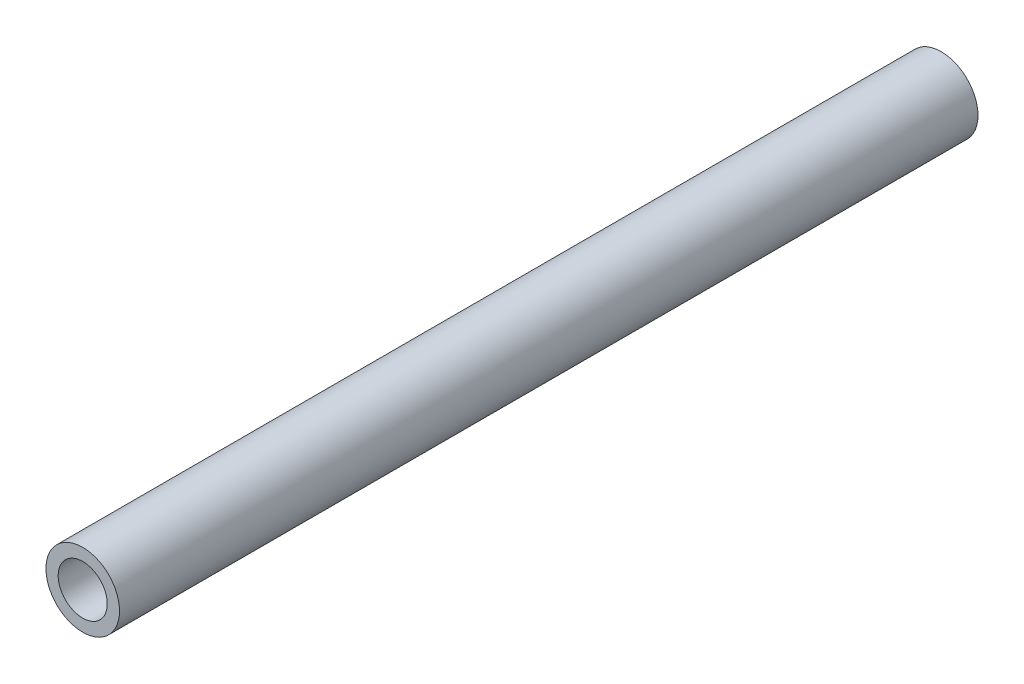
ISO-10303-21;
HEADER;
FILE_DESCRIPTION(('STEP AP214'),'2;1');
FILE_NAME('part.step','',(''),(''),'','','');
FILE_SCHEMA(('AUTOMOTIVE_DESIGN { 1 0 10303 214 1 1 1 1 }'));
ENDSEC;
DATA;
#1=APPLICATION_CONTEXT('core data for automotive mechanical design processes');
#2=APPLICATION_PROTOCOL_DEFINITION('international standard','automotive_design',2000,#1);
#3=PRODUCT_CONTEXT('',#1,'mechanical');
#4=PRODUCT('Part','Part','',(#3));
#5=PRODUCT_RELATED_PRODUCT_CATEGORY('part','',(#4));
#6=PRODUCT_DEFINITION_FORMATION('','',#4);
#7=PRODUCT_DEFINITION_CONTEXT('part definition',#1,'design');
#8=PRODUCT_DEFINITION('design','',#6,#7);
#9=PRODUCT_DEFINITION_SHAPE('','',#8);
#10=(LENGTH_UNIT() NAMED_UNIT(*) SI_UNIT(.MILLI.,.METRE.));
#11=(NAMED_UNIT(*) PLANE_ANGLE_UNIT() SI_UNIT($,.RADIAN.));
#12=(NAMED_UNIT(*) SI_UNIT($,.STERADIAN.) SOLID_ANGLE_UNIT());
#13=UNCERTAINTY_MEASURE_WITH_UNIT(LENGTH_MEASURE(1.E-05),#10,'distance_accuracy_value','');
#14=(GEOMETRIC_REPRESENTATION_CONTEXT(3) GLOBAL_UNCERTAINTY_ASSIGNED_CONTEXT((#13)) GLOBAL_UNIT_ASSIGNED_CONTEXT((#10,
#11,#12)) REPRESENTATION_CONTEXT('',''));
#15=CARTESIAN_POINT('',(0.,0.,0.));
#16=DIRECTION('',(0.,0.,1.));
#17=DIRECTION('',(1.,0.,0.));
#18=AXIS2_PLACEMENT_3D('',#15,#16,#17);
#19=CARTESIAN_POINT('',(0.,0.,70.));
#20=DIRECTION('',(0.,0.,1.));
#21=DIRECTION('',(1.,0.,0.));
#22=AXIS2_PLACEMENT_3D('',#19,#20,#21);
#23=PLANE('',#22);
#24=CARTESIAN_POINT('',(0.,0.,70.));
#25=DIRECTION('',(0.,0.,1.));
#26=DIRECTION('',(1.,0.,0.));
#27=AXIS2_PLACEMENT_3D('',#24,#25,#26);
#28=CIRCLE('',#27,3.);
#29=CARTESIAN_POINT('',(3.,0.,70.));
#30=VERTEX_POINT('',#29);
#31=EDGE_CURVE('E10',#30,#30,#28,.T.);
#32=ORIENTED_EDGE('',*,*,#31,.T.);
#33=EDGE_LOOP('',(#32));
#34=FACE_BOUND('',#33,.T.);
#35=CARTESIAN_POINT('',(0.,0.,70.));
#36=DIRECTION('',(0.,0.,1.));
#37=DIRECTION('',(1.,0.,0.));
#38=AXIS2_PLACEMENT_3D('',#35,#36,#37);
#39=CIRCLE('',#38,2.);
#40=CARTESIAN_POINT('',(2.,0.,70.));
#41=VERTEX_POINT('',#40);
#42=EDGE_CURVE('E54',#41,#41,#39,.T.);
#43=ORIENTED_EDGE('',*,*,#42,.F.);
#44=EDGE_LOOP('',(#43));
#45=FACE_BOUND('',#44,.T.);
#46=ADVANCED_FACE('F41',(#34,#45),#23,.T.);
#47=CARTESIAN_POINT('',(0.,0.,0.));
#48=DIRECTION('',(0.,0.,1.));
#49=DIRECTION('',(1.,0.,0.));
#50=AXIS2_PLACEMENT_3D('',#47,#48,#49);
#51=PLANE('',#50);
#52=CARTESIAN_POINT('',(0.,0.,0.));
#53=DIRECTION('',(0.,0.,1.));
#54=DIRECTION('',(1.,0.,0.));
#55=AXIS2_PLACEMENT_3D('',#52,#53,#54);
#56=CIRCLE('',#55,3.);
#57=CARTESIAN_POINT('',(3.,0.,0.));
#58=VERTEX_POINT('',#57);
#59=EDGE_CURVE('E45',#58,#58,#56,.T.);
#60=ORIENTED_EDGE('',*,*,#59,.F.);
#61=EDGE_LOOP('',(#60));
#62=FACE_BOUND('',#61,.T.);
#63=CARTESIAN_POINT('',(0.,0.,0.));
#64=DIRECTION('',(0.,0.,1.));
#65=DIRECTION('',(1.,0.,0.));
#66=AXIS2_PLACEMENT_3D('',#63,#64,#65);
#67=CIRCLE('',#66,2.);
#68=CARTESIAN_POINT('',(2.,0.,0.));
#69=VERTEX_POINT('',#68);
#70=EDGE_CURVE('E56',#69,#69,#67,.T.);
#71=ORIENTED_EDGE('',*,*,#70,.T.);
#72=EDGE_LOOP('',(#71));
#73=FACE_BOUND('',#72,.T.);
#74=ADVANCED_FACE('F68',(#62,#73),#51,.F.);
#75=CARTESIAN_POINT('',(0.,0.,70.));
#76=DIRECTION('',(0.,0.,-1.));
#77=DIRECTION('',(-1.,0.,0.));
#78=AXIS2_PLACEMENT_3D('',#75,#76,#77);
#79=CYLINDRICAL_SURFACE('',#78,3.);
#80=ORIENTED_EDGE('',*,*,#31,.F.);
#81=EDGE_LOOP('',(#80));
#82=FACE_BOUND('',#81,.T.);
#83=ORIENTED_EDGE('',*,*,#59,.T.);
#84=EDGE_LOOP('',(#83));
#85=FACE_BOUND('',#84,.T.);
#86=ADVANCED_FACE('F43',(#82,#85),#79,.T.);
#87=CARTESIAN_POINT('',(0.,0.,70.));
#88=DIRECTION('',(0.,0.,-1.));
#89=DIRECTION('',(-1.,0.,0.));
#90=AXIS2_PLACEMENT_3D('',#87,#88,#89);
#91=CYLINDRICAL_SURFACE('',#90,2.);
#92=ORIENTED_EDGE('',*,*,#42,.T.);
#93=EDGE_LOOP('',(#92));
#94=FACE_BOUND('',#93,.T.);
#95=ORIENTED_EDGE('',*,*,#70,.F.);
#96=EDGE_LOOP('',(#95));
#97=FACE_BOUND('',#96,.T.);
#98=ADVANCED_FACE('F64',(#94,#97),#91,.F.);
#99=CLOSED_SHELL('',(#46,#74,#86,#98));
#100=MANIFOLD_SOLID_BREP('B2',#99);
#101=ADVANCED_BREP_SHAPE_REPRESENTATION('',(#18,#100),#14);
#102=SHAPE_DEFINITION_REPRESENTATION(#9,#101);
ENDSEC;
END-ISO-10303-21;
